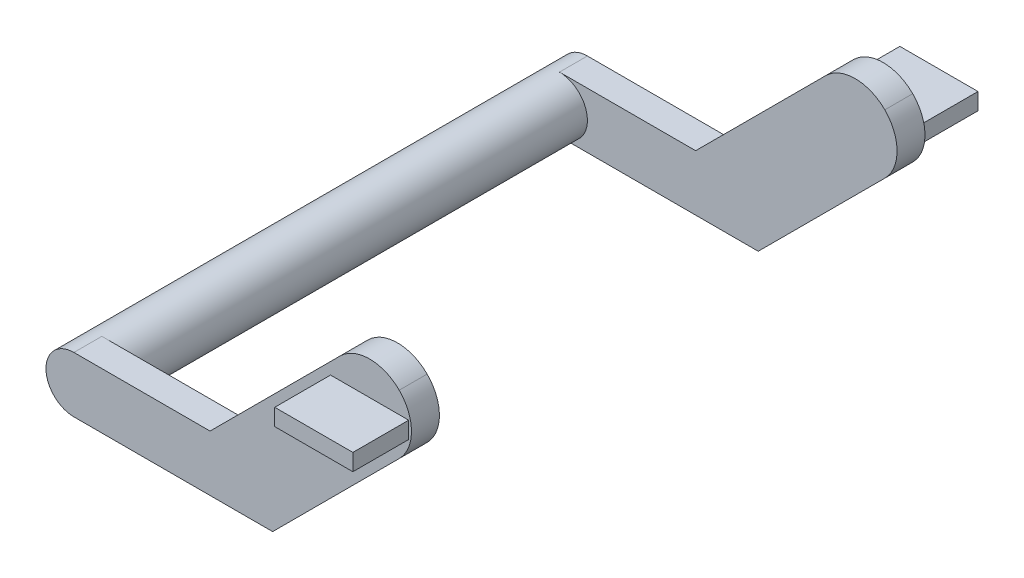
ISO-10303-21;
HEADER;
FILE_DESCRIPTION(('STEP AP214'),'2;1');
FILE_NAME('part.step','',(''),(''),'','','');
FILE_SCHEMA(('AUTOMOTIVE_DESIGN { 1 0 10303 214 1 1 1 1 }'));
ENDSEC;
DATA;
#1=APPLICATION_CONTEXT('core data for automotive mechanical design processes');
#2=APPLICATION_PROTOCOL_DEFINITION('international standard','automotive_design',2000,#1);
#3=PRODUCT_CONTEXT('',#1,'mechanical');
#4=PRODUCT('Part','Part','',(#3));
#5=PRODUCT_RELATED_PRODUCT_CATEGORY('part','',(#4));
#6=PRODUCT_DEFINITION_FORMATION('','',#4);
#7=PRODUCT_DEFINITION_CONTEXT('part definition',#1,'design');
#8=PRODUCT_DEFINITION('design','',#6,#7);
#9=PRODUCT_DEFINITION_SHAPE('','',#8);
#10=(LENGTH_UNIT() NAMED_UNIT(*) SI_UNIT(.MILLI.,.METRE.));
#11=(NAMED_UNIT(*) PLANE_ANGLE_UNIT() SI_UNIT($,.RADIAN.));
#12=(NAMED_UNIT(*) SI_UNIT($,.STERADIAN.) SOLID_ANGLE_UNIT());
#13=UNCERTAINTY_MEASURE_WITH_UNIT(LENGTH_MEASURE(1.E-05),#10,'distance_accuracy_value','');
#14=(GEOMETRIC_REPRESENTATION_CONTEXT(3) GLOBAL_UNCERTAINTY_ASSIGNED_CONTEXT((#13)) GLOBAL_UNIT_ASSIGNED_CONTEXT((#10,
#11,#12)) REPRESENTATION_CONTEXT('',''));
#15=CARTESIAN_POINT('',(0.,0.,0.));
#16=DIRECTION('',(0.,0.,1.));
#17=DIRECTION('',(1.,0.,0.));
#18=AXIS2_PLACEMENT_3D('',#15,#16,#17);
#19=CARTESIAN_POINT('',(0.,0.,-46.));
#20=DIRECTION('',(0.,0.,-1.));
#21=DIRECTION('',(1.,0.,0.));
#22=AXIS2_PLACEMENT_3D('',#19,#20,#21);
#23=PLANE('',#22);
#24=CARTESIAN_POINT('',(52.9809703885627,22.9809703885628,-46.));
#25=DIRECTION('',(0.,0.,-1.));
#26=DIRECTION('',(-1.,0.,0.));
#27=AXIS2_PLACEMENT_3D('',#24,#25,#26);
#28=CIRCLE('',#27,7.5);
#29=CARTESIAN_POINT('',(47.6776695296636,28.2842712474619,-46.));
#30=VERTEX_POINT('',#29);
#31=CARTESIAN_POINT('',(58.2842712474618,28.284271247462,-46.));
#32=VERTEX_POINT('',#31);
#33=EDGE_CURVE('E414',#30,#32,#28,.T.);
#34=ORIENTED_EDGE('',*,*,#33,.T.);
#35=CARTESIAN_POINT('',(52.9809703885627,22.9809703885628,-46.));
#36=DIRECTION('',(0.,0.,-1.));
#37=DIRECTION('',(-1.,0.,0.));
#38=AXIS2_PLACEMENT_3D('',#35,#36,#37);
#39=CIRCLE('',#38,7.5);
#40=CARTESIAN_POINT('',(58.2842712474619,17.6776695296637,-46.));
#41=VERTEX_POINT('',#40);
#42=EDGE_CURVE('E49',#32,#41,#39,.T.);
#43=ORIENTED_EDGE('',*,*,#42,.T.);
#44=DIRECTION('',(0.707106781186546,0.707106781186549,0.));
#45=VECTOR('',#44,1.);
#46=CARTESIAN_POINT('',(63.587572106361,22.9809703885629,-46.));
#47=LINE('',#46,#45);
#48=CARTESIAN_POINT('',(35.6066017177982,-5.,-46.));
#49=VERTEX_POINT('',#48);
#50=EDGE_CURVE('E291',#49,#41,#47,.T.);
#51=ORIENTED_EDGE('',*,*,#50,.F.);
#52=DIRECTION('',(1.,0.,0.));
#53=VECTOR('',#52,1.);
#54=CARTESIAN_POINT('',(35.6066017177982,-5.,-46.));
#55=LINE('',#54,#53);
#56=CARTESIAN_POINT('',(0.,-5.,-46.));
#57=VERTEX_POINT('',#56);
#58=EDGE_CURVE('E295',#57,#49,#55,.T.);
#59=ORIENTED_EDGE('',*,*,#58,.F.);
#60=CARTESIAN_POINT('',(0.,0.,-46.));
#61=DIRECTION('',(0.,0.,1.));
#62=DIRECTION('',(1.,0.,0.));
#63=AXIS2_PLACEMENT_3D('',#60,#61,#62);
#64=CIRCLE('',#63,5.);
#65=CARTESIAN_POINT('',(0.,5.,-46.));
#66=VERTEX_POINT('',#65);
#67=EDGE_CURVE('E279',#66,#57,#64,.T.);
#68=ORIENTED_EDGE('',*,*,#67,.F.);
#69=DIRECTION('',(-1.,0.,0.));
#70=VECTOR('',#69,1.);
#71=CARTESIAN_POINT('',(0.,5.,-46.));
#72=LINE('',#71,#70);
#73=CARTESIAN_POINT('',(24.3933982822018,5.,-46.));
#74=VERTEX_POINT('',#73);
#75=EDGE_CURVE('E283',#74,#66,#72,.T.);
#76=ORIENTED_EDGE('',*,*,#75,.F.);
#77=DIRECTION('',(-0.707106781186546,-0.707106781186549,0.));
#78=VECTOR('',#77,1.);
#79=CARTESIAN_POINT('',(24.3933982822018,5.,-46.));
#80=LINE('',#79,#78);
#81=EDGE_CURVE('E288',#30,#74,#80,.T.);
#82=ORIENTED_EDGE('',*,*,#81,.F.);
#83=EDGE_LOOP('',(#34,#43,#51,#59,#68,#76,#82));
#84=FACE_BOUND('',#83,.T.);
#85=DIRECTION('',(1.,0.,0.));
#86=VECTOR('',#85,1.);
#87=CARTESIAN_POINT('',(45.9809703885627,21.4809703885628,-46.));
#88=LINE('',#87,#86);
#89=CARTESIAN_POINT('',(45.9809703885627,21.4809703885628,-46.));
#90=VERTEX_POINT('',#89);
#91=CARTESIAN_POINT('',(59.9809703885627,21.4809703885628,-46.));
#92=VERTEX_POINT('',#91);
#93=EDGE_CURVE('E224',#90,#92,#88,.T.);
#94=ORIENTED_EDGE('',*,*,#93,.T.);
#95=DIRECTION('',(0.,1.,0.));
#96=VECTOR('',#95,1.);
#97=CARTESIAN_POINT('',(59.9809703885627,21.4809703885628,-46.));
#98=LINE('',#97,#96);
#99=CARTESIAN_POINT('',(59.9809703885627,24.4809703885628,-46.));
#100=VERTEX_POINT('',#99);
#101=EDGE_CURVE('E56',#92,#100,#98,.T.);
#102=ORIENTED_EDGE('',*,*,#101,.T.);
#103=DIRECTION('',(-1.,0.,0.));
#104=VECTOR('',#103,1.);
#105=CARTESIAN_POINT('',(45.9809703885627,24.4809703885628,-46.));
#106=LINE('',#105,#104);
#107=CARTESIAN_POINT('',(45.9809703885627,24.4809703885628,-46.));
#108=VERTEX_POINT('',#107);
#109=EDGE_CURVE('E210',#100,#108,#106,.T.);
#110=ORIENTED_EDGE('',*,*,#109,.T.);
#111=DIRECTION('',(0.,-1.,0.));
#112=VECTOR('',#111,1.);
#113=CARTESIAN_POINT('',(45.9809703885627,21.4809703885628,-46.));
#114=LINE('',#113,#112);
#115=EDGE_CURVE('E227',#108,#90,#114,.T.);
#116=ORIENTED_EDGE('',*,*,#115,.T.);
#117=EDGE_LOOP('',(#94,#102,#110,#116));
#118=FACE_BOUND('',#117,.T.);
#119=ADVANCED_FACE('F39',(#84,#118),#23,.T.);
#120=CARTESIAN_POINT('',(0.,0.,46.));
#121=DIRECTION('',(0.,0.,1.));
#122=DIRECTION('',(1.,0.,0.));
#123=AXIS2_PLACEMENT_3D('',#120,#121,#122);
#124=PLANE('',#123);
#125=DIRECTION('',(0.707106781186546,0.707106781186549,0.));
#126=VECTOR('',#125,1.);
#127=CARTESIAN_POINT('',(63.587572106361,22.9809703885629,46.));
#128=LINE('',#127,#126);
#129=CARTESIAN_POINT('',(35.6066017177982,-5.,46.));
#130=VERTEX_POINT('',#129);
#131=CARTESIAN_POINT('',(58.2842712474619,17.6776695296637,46.));
#132=VERTEX_POINT('',#131);
#133=EDGE_CURVE('E336',#130,#132,#128,.T.);
#134=ORIENTED_EDGE('',*,*,#133,.T.);
#135=CARTESIAN_POINT('',(52.9809703885627,22.9809703885628,46.));
#136=DIRECTION('',(0.,0.,1.));
#137=DIRECTION('',(1.,0.,0.));
#138=AXIS2_PLACEMENT_3D('',#135,#136,#137);
#139=CIRCLE('',#138,7.5);
#140=CARTESIAN_POINT('',(58.2842712474618,28.284271247462,46.));
#141=VERTEX_POINT('',#140);
#142=EDGE_CURVE('E395',#132,#141,#139,.T.);
#143=ORIENTED_EDGE('',*,*,#142,.T.);
#144=CARTESIAN_POINT('',(52.9809703885627,22.9809703885628,46.));
#145=DIRECTION('',(0.,0.,1.));
#146=DIRECTION('',(1.,0.,0.));
#147=AXIS2_PLACEMENT_3D('',#144,#145,#146);
#148=CIRCLE('',#147,7.5);
#149=CARTESIAN_POINT('',(47.6776695296636,28.2842712474619,46.));
#150=VERTEX_POINT('',#149);
#151=EDGE_CURVE('E392',#141,#150,#148,.T.);
#152=ORIENTED_EDGE('',*,*,#151,.T.);
#153=DIRECTION('',(-0.707106781186546,-0.707106781186549,0.));
#154=VECTOR('',#153,1.);
#155=CARTESIAN_POINT('',(24.3933982822018,5.,46.));
#156=LINE('',#155,#154);
#157=CARTESIAN_POINT('',(24.3933982822018,5.,46.));
#158=VERTEX_POINT('',#157);
#159=EDGE_CURVE('E340',#150,#158,#156,.T.);
#160=ORIENTED_EDGE('',*,*,#159,.T.);
#161=DIRECTION('',(-1.,0.,0.));
#162=VECTOR('',#161,1.);
#163=CARTESIAN_POINT('',(0.,5.,46.));
#164=LINE('',#163,#162);
#165=CARTESIAN_POINT('',(0.,5.,46.));
#166=VERTEX_POINT('',#165);
#167=EDGE_CURVE('E343',#158,#166,#164,.T.);
#168=ORIENTED_EDGE('',*,*,#167,.T.);
#169=CARTESIAN_POINT('',(0.,0.,46.));
#170=DIRECTION('',(0.,0.,1.));
#171=DIRECTION('',(1.,0.,0.));
#172=AXIS2_PLACEMENT_3D('',#169,#170,#171);
#173=CIRCLE('',#172,5.);
#174=CARTESIAN_POINT('',(0.,-5.,46.));
#175=VERTEX_POINT('',#174);
#176=EDGE_CURVE('E328',#166,#175,#173,.T.);
#177=ORIENTED_EDGE('',*,*,#176,.T.);
#178=DIRECTION('',(1.,0.,0.));
#179=VECTOR('',#178,1.);
#180=CARTESIAN_POINT('',(35.6066017177982,-5.,46.));
#181=LINE('',#180,#179);
#182=EDGE_CURVE('E332',#175,#130,#181,.T.);
#183=ORIENTED_EDGE('',*,*,#182,.T.);
#184=EDGE_LOOP('',(#134,#143,#152,#160,#168,#177,#183));
#185=FACE_BOUND('',#184,.T.);
#186=DIRECTION('',(-1.,0.,0.));
#187=VECTOR('',#186,1.);
#188=CARTESIAN_POINT('',(45.9809703885627,24.4809703885628,46.));
#189=LINE('',#188,#187);
#190=CARTESIAN_POINT('',(59.9809703885627,24.4809703885628,46.));
#191=VERTEX_POINT('',#190);
#192=CARTESIAN_POINT('',(45.9809703885627,24.4809703885628,46.));
#193=VERTEX_POINT('',#192);
#194=EDGE_CURVE('E259',#191,#193,#189,.T.);
#195=ORIENTED_EDGE('',*,*,#194,.F.);
#196=DIRECTION('',(0.,1.,0.));
#197=VECTOR('',#196,1.);
#198=CARTESIAN_POINT('',(59.9809703885627,21.4809703885628,46.));
#199=LINE('',#198,#197);
#200=CARTESIAN_POINT('',(59.9809703885627,21.4809703885628,46.));
#201=VERTEX_POINT('',#200);
#202=EDGE_CURVE('E198',#201,#191,#199,.T.);
#203=ORIENTED_EDGE('',*,*,#202,.F.);
#204=DIRECTION('',(1.,0.,0.));
#205=VECTOR('',#204,1.);
#206=CARTESIAN_POINT('',(45.9809703885627,21.4809703885628,46.));
#207=LINE('',#206,#205);
#208=CARTESIAN_POINT('',(45.9809703885627,21.4809703885628,46.));
#209=VERTEX_POINT('',#208);
#210=EDGE_CURVE('E246',#209,#201,#207,.T.);
#211=ORIENTED_EDGE('',*,*,#210,.F.);
#212=DIRECTION('',(0.,-1.,0.));
#213=VECTOR('',#212,1.);
#214=CARTESIAN_POINT('',(45.9809703885627,21.4809703885628,46.));
#215=LINE('',#214,#213);
#216=EDGE_CURVE('E262',#193,#209,#215,.T.);
#217=ORIENTED_EDGE('',*,*,#216,.F.);
#218=EDGE_LOOP('',(#195,#203,#211,#217));
#219=FACE_BOUND('',#218,.T.);
#220=ADVANCED_FACE('F462',(#185,#219),#124,.T.);
#221=CARTESIAN_POINT('',(0.,0.,-41.));
#222=DIRECTION('',(0.,0.,1.));
#223=DIRECTION('',(1.,0.,0.));
#224=AXIS2_PLACEMENT_3D('',#221,#222,#223);
#225=CYLINDRICAL_SURFACE('',#224,5.);
#226=CARTESIAN_POINT('',(0.,0.,-41.));
#227=DIRECTION('',(0.,0.,1.));
#228=DIRECTION('',(1.,0.,0.));
#229=AXIS2_PLACEMENT_3D('',#226,#227,#228);
#230=CIRCLE('',#229,5.);
#231=CARTESIAN_POINT('',(0.,-5.,-41.));
#232=VERTEX_POINT('',#231);
#233=CARTESIAN_POINT('',(0.,5.,-41.));
#234=VERTEX_POINT('',#233);
#235=EDGE_CURVE('E378',#232,#234,#230,.T.);
#236=ORIENTED_EDGE('',*,*,#235,.T.);
#237=DIRECTION('',(0.,0.,1.));
#238=VECTOR('',#237,1.);
#239=CARTESIAN_POINT('',(0.,5.,-46.));
#240=LINE('',#239,#238);
#241=EDGE_CURVE('E323',#66,#234,#240,.T.);
#242=ORIENTED_EDGE('',*,*,#241,.F.);
#243=ORIENTED_EDGE('',*,*,#67,.T.);
#244=DIRECTION('',(0.,0.,1.));
#245=VECTOR('',#244,1.);
#246=CARTESIAN_POINT('',(0.,-5.,-46.));
#247=LINE('',#246,#245);
#248=EDGE_CURVE('E299',#57,#232,#247,.T.);
#249=ORIENTED_EDGE('',*,*,#248,.T.);
#250=EDGE_LOOP('',(#236,#242,#243,#249));
#251=FACE_BOUND('',#250,.T.);
#252=CARTESIAN_POINT('',(0.,0.,41.));
#253=DIRECTION('',(0.,0.,1.));
#254=DIRECTION('',(1.,0.,0.));
#255=AXIS2_PLACEMENT_3D('',#252,#253,#254);
#256=CIRCLE('',#255,5.);
#257=CARTESIAN_POINT('',(0.,-5.,41.));
#258=VERTEX_POINT('',#257);
#259=CARTESIAN_POINT('',(0.,5.,41.));
#260=VERTEX_POINT('',#259);
#261=EDGE_CURVE('E375',#258,#260,#256,.T.);
#262=ORIENTED_EDGE('',*,*,#261,.F.);
#263=DIRECTION('',(0.,0.,-1.));
#264=VECTOR('',#263,1.);
#265=CARTESIAN_POINT('',(0.,-5.,46.));
#266=LINE('',#265,#264);
#267=EDGE_CURVE('E371',#175,#258,#266,.T.);
#268=ORIENTED_EDGE('',*,*,#267,.F.);
#269=ORIENTED_EDGE('',*,*,#176,.F.);
#270=DIRECTION('',(0.,0.,-1.));
#271=VECTOR('',#270,1.);
#272=CARTESIAN_POINT('',(0.,5.,46.));
#273=LINE('',#272,#271);
#274=EDGE_CURVE('E346',#166,#260,#273,.T.);
#275=ORIENTED_EDGE('',*,*,#274,.T.);
#276=EDGE_LOOP('',(#262,#268,#269,#275));
#277=FACE_BOUND('',#276,.T.);
#278=ADVANCED_FACE('F449',(#251,#277),#225,.T.);
#279=CARTESIAN_POINT('',(0.,0.,41.));
#280=DIRECTION('',(0.,0.,1.));
#281=DIRECTION('',(1.,0.,0.));
#282=AXIS2_PLACEMENT_3D('',#279,#280,#281);
#283=PLANE('',#282);
#284=CARTESIAN_POINT('',(52.9809703885627,22.9809703885628,41.));
#285=DIRECTION('',(0.,0.,1.));
#286=DIRECTION('',(1.,0.,0.));
#287=AXIS2_PLACEMENT_3D('',#284,#285,#286);
#288=CIRCLE('',#287,7.5);
#289=CARTESIAN_POINT('',(47.6776695296636,28.2842712474619,41.));
#290=VERTEX_POINT('',#289);
#291=CARTESIAN_POINT('',(58.2842712474618,28.284271247462,41.));
#292=VERTEX_POINT('',#291);
#293=EDGE_CURVE('E382',#290,#292,#288,.F.);
#294=ORIENTED_EDGE('',*,*,#293,.T.);
#295=CARTESIAN_POINT('',(52.9809703885627,22.9809703885628,41.));
#296=DIRECTION('',(0.,0.,1.));
#297=DIRECTION('',(1.,0.,0.));
#298=AXIS2_PLACEMENT_3D('',#295,#296,#297);
#299=CIRCLE('',#298,7.5);
#300=CARTESIAN_POINT('',(58.2842712474619,17.6776695296637,41.));
#301=VERTEX_POINT('',#300);
#302=EDGE_CURVE('E385',#292,#301,#299,.F.);
#303=ORIENTED_EDGE('',*,*,#302,.T.);
#304=DIRECTION('',(0.707106781186546,0.707106781186549,0.));
#305=VECTOR('',#304,1.);
#306=CARTESIAN_POINT('',(63.587572106361,22.9809703885629,41.));
#307=LINE('',#306,#305);
#308=CARTESIAN_POINT('',(35.6066017177982,-5.,41.));
#309=VERTEX_POINT('',#308);
#310=EDGE_CURVE('E350',#309,#301,#307,.T.);
#311=ORIENTED_EDGE('',*,*,#310,.F.);
#312=DIRECTION('',(1.,0.,0.));
#313=VECTOR('',#312,1.);
#314=CARTESIAN_POINT('',(35.6066017177982,-5.,41.));
#315=LINE('',#314,#313);
#316=EDGE_CURVE('E347',#258,#309,#315,.T.);
#317=ORIENTED_EDGE('',*,*,#316,.F.);
#318=ORIENTED_EDGE('',*,*,#261,.T.);
#319=DIRECTION('',(-1.,0.,0.));
#320=VECTOR('',#319,1.);
#321=CARTESIAN_POINT('',(0.,5.,41.));
#322=LINE('',#321,#320);
#323=CARTESIAN_POINT('',(24.3933982822018,5.,41.));
#324=VERTEX_POINT('',#323);
#325=EDGE_CURVE('E333',#324,#260,#322,.T.);
#326=ORIENTED_EDGE('',*,*,#325,.F.);
#327=DIRECTION('',(-0.707106781186546,-0.707106781186549,0.));
#328=VECTOR('',#327,1.);
#329=CARTESIAN_POINT('',(24.3933982822018,5.,41.));
#330=LINE('',#329,#328);
#331=EDGE_CURVE('E354',#290,#324,#330,.T.);
#332=ORIENTED_EDGE('',*,*,#331,.F.);
#333=EDGE_LOOP('',(#294,#303,#311,#317,#318,#326,#332));
#334=FACE_BOUND('',#333,.T.);
#335=ADVANCED_FACE('F592',(#334),#283,.F.);
#336=CARTESIAN_POINT('',(35.6066017177982,-5.,46.));
#337=DIRECTION('',(0.,1.,0.));
#338=DIRECTION('',(0.,0.,1.));
#339=AXIS2_PLACEMENT_3D('',#336,#337,#338);
#340=PLANE('',#339);
#341=ORIENTED_EDGE('',*,*,#316,.T.);
#342=DIRECTION('',(0.,0.,-1.));
#343=VECTOR('',#342,1.);
#344=CARTESIAN_POINT('',(35.6066017177982,-5.,46.));
#345=LINE('',#344,#343);
#346=EDGE_CURVE('E367',#130,#309,#345,.T.);
#347=ORIENTED_EDGE('',*,*,#346,.F.);
#348=ORIENTED_EDGE('',*,*,#182,.F.);
#349=ORIENTED_EDGE('',*,*,#267,.T.);
#350=EDGE_LOOP('',(#341,#347,#348,#349));
#351=FACE_BOUND('',#350,.T.);
#352=ADVANCED_FACE('F635',(#351),#340,.F.);
#353=CARTESIAN_POINT('',(63.587572106361,22.9809703885629,46.));
#354=DIRECTION('',(-0.707106781186549,0.707106781186546,0.));
#355=DIRECTION('',(-0.707106781186546,-0.707106781186549,0.));
#356=AXIS2_PLACEMENT_3D('',#353,#354,#355);
#357=PLANE('',#356);
#358=ORIENTED_EDGE('',*,*,#310,.T.);
#359=DIRECTION('',(0.,0.,-1.));
#360=VECTOR('',#359,1.);
#361=CARTESIAN_POINT('',(58.2842712474619,17.6776695296637,46.));
#362=LINE('',#361,#360);
#363=EDGE_CURVE('E388',#301,#132,#362,.F.);
#364=ORIENTED_EDGE('',*,*,#363,.T.);
#365=ORIENTED_EDGE('',*,*,#133,.F.);
#366=ORIENTED_EDGE('',*,*,#346,.T.);
#367=EDGE_LOOP('',(#358,#364,#365,#366));
#368=FACE_BOUND('',#367,.T.);
#369=ADVANCED_FACE('F625',(#368),#357,.F.);
#370=CARTESIAN_POINT('',(24.3933982822018,5.,46.));
#371=DIRECTION('',(0.707106781186549,-0.707106781186546,0.));
#372=DIRECTION('',(0.707106781186546,0.707106781186549,0.));
#373=AXIS2_PLACEMENT_3D('',#370,#371,#372);
#374=PLANE('',#373);
#375=ORIENTED_EDGE('',*,*,#159,.F.);
#376=DIRECTION('',(0.,0.,-1.));
#377=VECTOR('',#376,1.);
#378=CARTESIAN_POINT('',(47.6776695296636,28.2842712474619,46.));
#379=LINE('',#378,#377);
#380=EDGE_CURVE('E398',#150,#290,#379,.T.);
#381=ORIENTED_EDGE('',*,*,#380,.T.);
#382=ORIENTED_EDGE('',*,*,#331,.T.);
#383=DIRECTION('',(0.,0.,-1.));
#384=VECTOR('',#383,1.);
#385=CARTESIAN_POINT('',(24.3933982822018,5.,46.));
#386=LINE('',#385,#384);
#387=EDGE_CURVE('E363',#158,#324,#386,.T.);
#388=ORIENTED_EDGE('',*,*,#387,.F.);
#389=EDGE_LOOP('',(#375,#381,#382,#388));
#390=FACE_BOUND('',#389,.T.);
#391=ADVANCED_FACE('F620',(#390),#374,.F.);
#392=CARTESIAN_POINT('',(0.,5.,46.));
#393=DIRECTION('',(0.,-1.,0.));
#394=DIRECTION('',(0.,0.,-1.));
#395=AXIS2_PLACEMENT_3D('',#392,#393,#394);
#396=PLANE('',#395);
#397=ORIENTED_EDGE('',*,*,#325,.T.);
#398=ORIENTED_EDGE('',*,*,#274,.F.);
#399=ORIENTED_EDGE('',*,*,#167,.F.);
#400=ORIENTED_EDGE('',*,*,#387,.T.);
#401=EDGE_LOOP('',(#397,#398,#399,#400));
#402=FACE_BOUND('',#401,.T.);
#403=ADVANCED_FACE('F612',(#402),#396,.F.);
#404=CARTESIAN_POINT('',(52.9809703885627,22.9809703885628,46.));
#405=DIRECTION('',(0.,0.,-1.));
#406=DIRECTION('',(-1.,0.,0.));
#407=AXIS2_PLACEMENT_3D('',#404,#405,#406);
#408=CYLINDRICAL_SURFACE('',#407,7.5);
#409=ORIENTED_EDGE('',*,*,#380,.F.);
#410=ORIENTED_EDGE('',*,*,#151,.F.);
#411=DIRECTION('',(0.,0.,-1.));
#412=VECTOR('',#411,1.);
#413=CARTESIAN_POINT('',(58.2842712474618,28.284271247462,46.));
#414=LINE('',#413,#412);
#415=EDGE_CURVE('E327',#292,#141,#414,.F.);
#416=ORIENTED_EDGE('',*,*,#415,.F.);
#417=ORIENTED_EDGE('',*,*,#293,.F.);
#418=EDGE_LOOP('',(#409,#410,#416,#417));
#419=FACE_BOUND('',#418,.T.);
#420=ADVANCED_FACE('F602',(#419),#408,.T.);
#421=CARTESIAN_POINT('',(52.9809703885627,22.9809703885628,46.));
#422=DIRECTION('',(0.,0.,-1.));
#423=DIRECTION('',(-1.,0.,0.));
#424=AXIS2_PLACEMENT_3D('',#421,#422,#423);
#425=CYLINDRICAL_SURFACE('',#424,7.5);
#426=ORIENTED_EDGE('',*,*,#142,.F.);
#427=ORIENTED_EDGE('',*,*,#363,.F.);
#428=ORIENTED_EDGE('',*,*,#302,.F.);
#429=ORIENTED_EDGE('',*,*,#415,.T.);
#430=EDGE_LOOP('',(#426,#427,#428,#429));
#431=FACE_BOUND('',#430,.T.);
#432=ADVANCED_FACE('F582',(#431),#425,.T.);
#433=CARTESIAN_POINT('',(0.,5.,-46.));
#434=DIRECTION('',(0.,1.,0.));
#435=DIRECTION('',(0.,0.,1.));
#436=AXIS2_PLACEMENT_3D('',#433,#434,#435);
#437=PLANE('',#436);
#438=DIRECTION('',(-1.,0.,0.));
#439=VECTOR('',#438,1.);
#440=CARTESIAN_POINT('',(0.,5.,-41.));
#441=LINE('',#440,#439);
#442=CARTESIAN_POINT('',(24.3933982822018,5.,-41.));
#443=VERTEX_POINT('',#442);
#444=EDGE_CURVE('E300',#443,#234,#441,.T.);
#445=ORIENTED_EDGE('',*,*,#444,.F.);
#446=DIRECTION('',(0.,0.,1.));
#447=VECTOR('',#446,1.);
#448=CARTESIAN_POINT('',(24.3933982822018,5.,-46.));
#449=LINE('',#448,#447);
#450=EDGE_CURVE('E319',#74,#443,#449,.T.);
#451=ORIENTED_EDGE('',*,*,#450,.F.);
#452=ORIENTED_EDGE('',*,*,#75,.T.);
#453=ORIENTED_EDGE('',*,*,#241,.T.);
#454=EDGE_LOOP('',(#445,#451,#452,#453));
#455=FACE_BOUND('',#454,.T.);
#456=ADVANCED_FACE('F446',(#455),#437,.T.);
#457=CARTESIAN_POINT('',(24.3933982822018,5.,-46.));
#458=DIRECTION('',(-0.707106781186549,0.707106781186546,0.));
#459=DIRECTION('',(-0.707106781186546,-0.707106781186549,0.));
#460=AXIS2_PLACEMENT_3D('',#457,#458,#459);
#461=PLANE('',#460);
#462=DIRECTION('',(-0.707106781186546,-0.707106781186549,0.));
#463=VECTOR('',#462,1.);
#464=CARTESIAN_POINT('',(24.3933982822018,5.,-41.));
#465=LINE('',#464,#463);
#466=CARTESIAN_POINT('',(47.6776695296636,28.2842712474619,-41.));
#467=VERTEX_POINT('',#466);
#468=EDGE_CURVE('E303',#467,#443,#465,.T.);
#469=ORIENTED_EDGE('',*,*,#468,.F.);
#470=DIRECTION('',(0.,0.,1.));
#471=VECTOR('',#470,1.);
#472=CARTESIAN_POINT('',(47.6776695296636,28.2842712474619,-46.));
#473=LINE('',#472,#471);
#474=EDGE_CURVE('E11',#467,#30,#473,.F.);
#475=ORIENTED_EDGE('',*,*,#474,.T.);
#476=ORIENTED_EDGE('',*,*,#81,.T.);
#477=ORIENTED_EDGE('',*,*,#450,.T.);
#478=EDGE_LOOP('',(#469,#475,#476,#477));
#479=FACE_BOUND('',#478,.T.);
#480=ADVANCED_FACE('F440',(#479),#461,.T.);
#481=CARTESIAN_POINT('',(63.587572106361,22.9809703885629,-46.));
#482=DIRECTION('',(0.707106781186549,-0.707106781186546,0.));
#483=DIRECTION('',(0.707106781186546,0.707106781186549,0.));
#484=AXIS2_PLACEMENT_3D('',#481,#482,#483);
#485=PLANE('',#484);
#486=ORIENTED_EDGE('',*,*,#50,.T.);
#487=DIRECTION('',(0.,0.,1.));
#488=VECTOR('',#487,1.);
#489=CARTESIAN_POINT('',(58.2842712474619,17.6776695296637,-46.));
#490=LINE('',#489,#488);
#491=CARTESIAN_POINT('',(58.2842712474619,17.6776695296637,-41.));
#492=VERTEX_POINT('',#491);
#493=EDGE_CURVE('E401',#41,#492,#490,.T.);
#494=ORIENTED_EDGE('',*,*,#493,.T.);
#495=DIRECTION('',(0.707106781186546,0.707106781186549,0.));
#496=VECTOR('',#495,1.);
#497=CARTESIAN_POINT('',(63.587572106361,22.9809703885629,-41.));
#498=LINE('',#497,#496);
#499=CARTESIAN_POINT('',(35.6066017177982,-5.,-41.));
#500=VERTEX_POINT('',#499);
#501=EDGE_CURVE('E306',#500,#492,#498,.T.);
#502=ORIENTED_EDGE('',*,*,#501,.F.);
#503=DIRECTION('',(0.,0.,1.));
#504=VECTOR('',#503,1.);
#505=CARTESIAN_POINT('',(35.6066017177982,-5.,-46.));
#506=LINE('',#505,#504);
#507=EDGE_CURVE('E316',#49,#500,#506,.T.);
#508=ORIENTED_EDGE('',*,*,#507,.F.);
#509=EDGE_LOOP('',(#486,#494,#502,#508));
#510=FACE_BOUND('',#509,.T.);
#511=ADVANCED_FACE('F430',(#510),#485,.T.);
#512=CARTESIAN_POINT('',(35.6066017177982,-5.,-46.));
#513=DIRECTION('',(0.,-1.,0.));
#514=DIRECTION('',(0.,0.,-1.));
#515=AXIS2_PLACEMENT_3D('',#512,#513,#514);
#516=PLANE('',#515);
#517=DIRECTION('',(1.,0.,0.));
#518=VECTOR('',#517,1.);
#519=CARTESIAN_POINT('',(35.6066017177982,-5.,-41.));
#520=LINE('',#519,#518);
#521=EDGE_CURVE('E284',#232,#500,#520,.T.);
#522=ORIENTED_EDGE('',*,*,#521,.F.);
#523=ORIENTED_EDGE('',*,*,#248,.F.);
#524=ORIENTED_EDGE('',*,*,#58,.T.);
#525=ORIENTED_EDGE('',*,*,#507,.T.);
#526=EDGE_LOOP('',(#522,#523,#524,#525));
#527=FACE_BOUND('',#526,.T.);
#528=ADVANCED_FACE('F452',(#527),#516,.T.);
#529=CARTESIAN_POINT('',(0.,0.,-41.));
#530=DIRECTION('',(0.,0.,-1.));
#531=DIRECTION('',(1.,0.,0.));
#532=AXIS2_PLACEMENT_3D('',#529,#530,#531);
#533=PLANE('',#532);
#534=ORIENTED_EDGE('',*,*,#501,.T.);
#535=CARTESIAN_POINT('',(52.9809703885627,22.9809703885628,-41.));
#536=DIRECTION('',(0.,0.,-1.));
#537=DIRECTION('',(-1.,0.,0.));
#538=AXIS2_PLACEMENT_3D('',#535,#536,#537);
#539=CIRCLE('',#538,7.5);
#540=CARTESIAN_POINT('',(58.2842712474618,28.284271247462,-41.));
#541=VERTEX_POINT('',#540);
#542=EDGE_CURVE('E411',#492,#541,#539,.F.);
#543=ORIENTED_EDGE('',*,*,#542,.T.);
#544=CARTESIAN_POINT('',(52.9809703885627,22.9809703885628,-41.));
#545=DIRECTION('',(0.,0.,-1.));
#546=DIRECTION('',(-1.,0.,0.));
#547=AXIS2_PLACEMENT_3D('',#544,#545,#546);
#548=CIRCLE('',#547,7.5);
#549=EDGE_CURVE('E408',#541,#467,#548,.F.);
#550=ORIENTED_EDGE('',*,*,#549,.T.);
#551=ORIENTED_EDGE('',*,*,#468,.T.);
#552=ORIENTED_EDGE('',*,*,#444,.T.);
#553=ORIENTED_EDGE('',*,*,#235,.F.);
#554=ORIENTED_EDGE('',*,*,#521,.T.);
#555=EDGE_LOOP('',(#534,#543,#550,#551,#552,#553,#554));
#556=FACE_BOUND('',#555,.T.);
#557=ADVANCED_FACE('F435',(#556),#533,.F.);
#558=CARTESIAN_POINT('',(52.9809703885627,22.9809703885628,-46.));
#559=DIRECTION('',(0.,0.,1.));
#560=DIRECTION('',(1.,0.,0.));
#561=AXIS2_PLACEMENT_3D('',#558,#559,#560);
#562=CYLINDRICAL_SURFACE('',#561,7.5);
#563=DIRECTION('',(0.,0.,1.));
#564=VECTOR('',#563,1.);
#565=CARTESIAN_POINT('',(58.2842712474618,28.284271247462,-46.));
#566=LINE('',#565,#564);
#567=EDGE_CURVE('E43',#32,#541,#566,.T.);
#568=ORIENTED_EDGE('',*,*,#567,.F.);
#569=ORIENTED_EDGE('',*,*,#33,.F.);
#570=ORIENTED_EDGE('',*,*,#474,.F.);
#571=ORIENTED_EDGE('',*,*,#549,.F.);
#572=EDGE_LOOP('',(#568,#569,#570,#571));
#573=FACE_BOUND('',#572,.T.);
#574=ADVANCED_FACE('F41',(#573),#562,.T.);
#575=CARTESIAN_POINT('',(52.9809703885627,22.9809703885628,-46.));
#576=DIRECTION('',(0.,0.,1.));
#577=DIRECTION('',(1.,0.,0.));
#578=AXIS2_PLACEMENT_3D('',#575,#576,#577);
#579=CYLINDRICAL_SURFACE('',#578,7.5);
#580=ORIENTED_EDGE('',*,*,#42,.F.);
#581=ORIENTED_EDGE('',*,*,#567,.T.);
#582=ORIENTED_EDGE('',*,*,#542,.F.);
#583=ORIENTED_EDGE('',*,*,#493,.F.);
#584=EDGE_LOOP('',(#580,#581,#582,#583));
#585=FACE_BOUND('',#584,.T.);
#586=ADVANCED_FACE('F432',(#585),#579,.T.);
#587=CARTESIAN_POINT('',(59.9809703885627,21.4809703885628,56.));
#588=DIRECTION('',(-1.,0.,0.));
#589=DIRECTION('',(0.,0.,1.));
#590=AXIS2_PLACEMENT_3D('',#587,#588,#589);
#591=PLANE('',#590);
#592=ORIENTED_EDGE('',*,*,#202,.T.);
#593=DIRECTION('',(0.,0.,-1.));
#594=VECTOR('',#593,1.);
#595=CARTESIAN_POINT('',(59.9809703885627,24.4809703885628,56.));
#596=LINE('',#595,#594);
#597=CARTESIAN_POINT('',(59.9809703885627,24.4809703885628,56.));
#598=VERTEX_POINT('',#597);
#599=EDGE_CURVE('E276',#598,#191,#596,.T.);
#600=ORIENTED_EDGE('',*,*,#599,.F.);
#601=DIRECTION('',(0.,1.,0.));
#602=VECTOR('',#601,1.);
#603=CARTESIAN_POINT('',(59.9809703885627,21.4809703885628,56.));
#604=LINE('',#603,#602);
#605=CARTESIAN_POINT('',(59.9809703885627,21.4809703885628,56.));
#606=VERTEX_POINT('',#605);
#607=EDGE_CURVE('E241',#606,#598,#604,.T.);
#608=ORIENTED_EDGE('',*,*,#607,.F.);
#609=DIRECTION('',(0.,0.,-1.));
#610=VECTOR('',#609,1.);
#611=CARTESIAN_POINT('',(59.9809703885627,21.4809703885628,56.));
#612=LINE('',#611,#610);
#613=EDGE_CURVE('E255',#606,#201,#612,.T.);
#614=ORIENTED_EDGE('',*,*,#613,.T.);
#615=EDGE_LOOP('',(#592,#600,#608,#614));
#616=FACE_BOUND('',#615,.T.);
#617=ADVANCED_FACE('F470',(#616),#591,.F.);
#618=CARTESIAN_POINT('',(45.9809703885627,24.4809703885628,56.));
#619=DIRECTION('',(0.,-1.,0.));
#620=DIRECTION('',(0.,0.,-1.));
#621=AXIS2_PLACEMENT_3D('',#618,#619,#620);
#622=PLANE('',#621);
#623=ORIENTED_EDGE('',*,*,#194,.T.);
#624=DIRECTION('',(0.,0.,-1.));
#625=VECTOR('',#624,1.);
#626=CARTESIAN_POINT('',(45.9809703885627,24.4809703885628,56.));
#627=LINE('',#626,#625);
#628=CARTESIAN_POINT('',(45.9809703885627,24.4809703885628,56.));
#629=VERTEX_POINT('',#628);
#630=EDGE_CURVE('E272',#629,#193,#627,.T.);
#631=ORIENTED_EDGE('',*,*,#630,.F.);
#632=DIRECTION('',(-1.,0.,0.));
#633=VECTOR('',#632,1.);
#634=CARTESIAN_POINT('',(45.9809703885627,24.4809703885628,56.));
#635=LINE('',#634,#633);
#636=EDGE_CURVE('E245',#598,#629,#635,.T.);
#637=ORIENTED_EDGE('',*,*,#636,.F.);
#638=ORIENTED_EDGE('',*,*,#599,.T.);
#639=EDGE_LOOP('',(#623,#631,#637,#638));
#640=FACE_BOUND('',#639,.T.);
#641=ADVANCED_FACE('F473',(#640),#622,.F.);
#642=CARTESIAN_POINT('',(45.9809703885627,21.4809703885628,56.));
#643=DIRECTION('',(1.,0.,0.));
#644=DIRECTION('',(0.,0.,-1.));
#645=AXIS2_PLACEMENT_3D('',#642,#643,#644);
#646=PLANE('',#645);
#647=ORIENTED_EDGE('',*,*,#216,.T.);
#648=DIRECTION('',(0.,0.,-1.));
#649=VECTOR('',#648,1.);
#650=CARTESIAN_POINT('',(45.9809703885627,21.4809703885628,56.));
#651=LINE('',#650,#649);
#652=CARTESIAN_POINT('',(45.9809703885627,21.4809703885628,56.));
#653=VERTEX_POINT('',#652);
#654=EDGE_CURVE('E64',#653,#209,#651,.T.);
#655=ORIENTED_EDGE('',*,*,#654,.F.);
#656=DIRECTION('',(0.,-1.,0.));
#657=VECTOR('',#656,1.);
#658=CARTESIAN_POINT('',(45.9809703885627,21.4809703885628,56.));
#659=LINE('',#658,#657);
#660=EDGE_CURVE('E249',#629,#653,#659,.T.);
#661=ORIENTED_EDGE('',*,*,#660,.F.);
#662=ORIENTED_EDGE('',*,*,#630,.T.);
#663=EDGE_LOOP('',(#647,#655,#661,#662));
#664=FACE_BOUND('',#663,.T.);
#665=ADVANCED_FACE('F477',(#664),#646,.F.);
#666=CARTESIAN_POINT('',(45.9809703885627,21.4809703885628,56.));
#667=DIRECTION('',(0.,1.,0.));
#668=DIRECTION('',(0.,0.,1.));
#669=AXIS2_PLACEMENT_3D('',#666,#667,#668);
#670=PLANE('',#669);
#671=ORIENTED_EDGE('',*,*,#210,.T.);
#672=ORIENTED_EDGE('',*,*,#613,.F.);
#673=DIRECTION('',(1.,0.,0.));
#674=VECTOR('',#673,1.);
#675=CARTESIAN_POINT('',(45.9809703885627,21.4809703885628,56.));
#676=LINE('',#675,#674);
#677=EDGE_CURVE('E252',#653,#606,#676,.T.);
#678=ORIENTED_EDGE('',*,*,#677,.F.);
#679=ORIENTED_EDGE('',*,*,#654,.T.);
#680=EDGE_LOOP('',(#671,#672,#678,#679));
#681=FACE_BOUND('',#680,.T.);
#682=ADVANCED_FACE('F481',(#681),#670,.F.);
#683=CARTESIAN_POINT('',(0.,0.,56.));
#684=DIRECTION('',(0.,0.,-1.));
#685=DIRECTION('',(-1.,0.,0.));
#686=AXIS2_PLACEMENT_3D('',#683,#684,#685);
#687=PLANE('',#686);
#688=ORIENTED_EDGE('',*,*,#607,.T.);
#689=ORIENTED_EDGE('',*,*,#636,.T.);
#690=ORIENTED_EDGE('',*,*,#660,.T.);
#691=ORIENTED_EDGE('',*,*,#677,.T.);
#692=EDGE_LOOP('',(#688,#689,#690,#691));
#693=FACE_BOUND('',#692,.T.);
#694=ADVANCED_FACE('F485',(#693),#687,.F.);
#695=CARTESIAN_POINT('',(59.9809703885627,21.4809703885628,-56.));
#696=DIRECTION('',(1.,0.,0.));
#697=DIRECTION('',(0.,0.,-1.));
#698=AXIS2_PLACEMENT_3D('',#695,#696,#697);
#699=PLANE('',#698);
#700=ORIENTED_EDGE('',*,*,#101,.F.);
#701=DIRECTION('',(0.,0.,1.));
#702=VECTOR('',#701,1.);
#703=CARTESIAN_POINT('',(59.9809703885627,21.4809703885628,-56.));
#704=LINE('',#703,#702);
#705=CARTESIAN_POINT('',(59.9809703885627,21.4809703885628,-56.));
#706=VERTEX_POINT('',#705);
#707=EDGE_CURVE('E188',#706,#92,#704,.T.);
#708=ORIENTED_EDGE('',*,*,#707,.F.);
#709=DIRECTION('',(0.,1.,0.));
#710=VECTOR('',#709,1.);
#711=CARTESIAN_POINT('',(59.9809703885627,21.4809703885628,-56.));
#712=LINE('',#711,#710);
#713=CARTESIAN_POINT('',(59.9809703885627,24.4809703885628,-56.));
#714=VERTEX_POINT('',#713);
#715=EDGE_CURVE('E191',#706,#714,#712,.T.);
#716=ORIENTED_EDGE('',*,*,#715,.T.);
#717=DIRECTION('',(0.,0.,1.));
#718=VECTOR('',#717,1.);
#719=CARTESIAN_POINT('',(59.9809703885627,24.4809703885628,-56.));
#720=LINE('',#719,#718);
#721=EDGE_CURVE('E221',#714,#100,#720,.T.);
#722=ORIENTED_EDGE('',*,*,#721,.T.);
#723=EDGE_LOOP('',(#700,#708,#716,#722));
#724=FACE_BOUND('',#723,.T.);
#725=ADVANCED_FACE('F190',(#724),#699,.T.);
#726=CARTESIAN_POINT('',(45.9809703885627,21.4809703885628,-56.));
#727=DIRECTION('',(0.,-1.,0.));
#728=DIRECTION('',(0.,0.,-1.));
#729=AXIS2_PLACEMENT_3D('',#726,#727,#728);
#730=PLANE('',#729);
#731=ORIENTED_EDGE('',*,*,#93,.F.);
#732=DIRECTION('',(0.,0.,1.));
#733=VECTOR('',#732,1.);
#734=CARTESIAN_POINT('',(45.9809703885627,21.4809703885628,-56.));
#735=LINE('',#734,#733);
#736=CARTESIAN_POINT('',(45.9809703885627,21.4809703885628,-56.));
#737=VERTEX_POINT('',#736);
#738=EDGE_CURVE('E199',#737,#90,#735,.T.);
#739=ORIENTED_EDGE('',*,*,#738,.F.);
#740=DIRECTION('',(1.,0.,0.));
#741=VECTOR('',#740,1.);
#742=CARTESIAN_POINT('',(45.9809703885627,21.4809703885628,-56.));
#743=LINE('',#742,#741);
#744=EDGE_CURVE('E205',#737,#706,#743,.T.);
#745=ORIENTED_EDGE('',*,*,#744,.T.);
#746=ORIENTED_EDGE('',*,*,#707,.T.);
#747=EDGE_LOOP('',(#731,#739,#745,#746));
#748=FACE_BOUND('',#747,.T.);
#749=ADVANCED_FACE('F212',(#748),#730,.T.);
#750=CARTESIAN_POINT('',(45.9809703885627,21.4809703885628,-56.));
#751=DIRECTION('',(-1.,0.,0.));
#752=DIRECTION('',(0.,0.,1.));
#753=AXIS2_PLACEMENT_3D('',#750,#751,#752);
#754=PLANE('',#753);
#755=ORIENTED_EDGE('',*,*,#115,.F.);
#756=DIRECTION('',(0.,0.,1.));
#757=VECTOR('',#756,1.);
#758=CARTESIAN_POINT('',(45.9809703885627,24.4809703885628,-56.));
#759=LINE('',#758,#757);
#760=CARTESIAN_POINT('',(45.9809703885627,24.4809703885628,-56.));
#761=VERTEX_POINT('',#760);
#762=EDGE_CURVE('E236',#761,#108,#759,.T.);
#763=ORIENTED_EDGE('',*,*,#762,.F.);
#764=DIRECTION('',(0.,-1.,0.));
#765=VECTOR('',#764,1.);
#766=CARTESIAN_POINT('',(45.9809703885627,21.4809703885628,-56.));
#767=LINE('',#766,#765);
#768=EDGE_CURVE('E214',#761,#737,#767,.T.);
#769=ORIENTED_EDGE('',*,*,#768,.T.);
#770=ORIENTED_EDGE('',*,*,#738,.T.);
#771=EDGE_LOOP('',(#755,#763,#769,#770));
#772=FACE_BOUND('',#771,.T.);
#773=ADVANCED_FACE('F493',(#772),#754,.T.);
#774=CARTESIAN_POINT('',(45.9809703885627,24.4809703885628,-56.));
#775=DIRECTION('',(0.,1.,0.));
#776=DIRECTION('',(0.,0.,1.));
#777=AXIS2_PLACEMENT_3D('',#774,#775,#776);
#778=PLANE('',#777);
#779=ORIENTED_EDGE('',*,*,#109,.F.);
#780=ORIENTED_EDGE('',*,*,#721,.F.);
#781=DIRECTION('',(-1.,0.,0.));
#782=VECTOR('',#781,1.);
#783=CARTESIAN_POINT('',(45.9809703885627,24.4809703885628,-56.));
#784=LINE('',#783,#782);
#785=EDGE_CURVE('E208',#714,#761,#784,.T.);
#786=ORIENTED_EDGE('',*,*,#785,.T.);
#787=ORIENTED_EDGE('',*,*,#762,.T.);
#788=EDGE_LOOP('',(#779,#780,#786,#787));
#789=FACE_BOUND('',#788,.T.);
#790=ADVANCED_FACE('F496',(#789),#778,.T.);
#791=CARTESIAN_POINT('',(0.,0.,-56.));
#792=DIRECTION('',(0.,0.,1.));
#793=DIRECTION('',(-1.,0.,0.));
#794=AXIS2_PLACEMENT_3D('',#791,#792,#793);
#795=PLANE('',#794);
#796=ORIENTED_EDGE('',*,*,#715,.F.);
#797=ORIENTED_EDGE('',*,*,#744,.F.);
#798=ORIENTED_EDGE('',*,*,#768,.F.);
#799=ORIENTED_EDGE('',*,*,#785,.F.);
#800=EDGE_LOOP('',(#796,#797,#798,#799));
#801=FACE_BOUND('',#800,.T.);
#802=ADVANCED_FACE('F203',(#801),#795,.F.);
#803=CLOSED_SHELL('',(#119,#220,#278,#335,#352,#369,#391,#403,#420,#432,#456,#480,#511,#528,
#557,#574,#586,#617,#641,#665,#682,#694,#725,#749,#773,#790,#802));
#804=MANIFOLD_SOLID_BREP('B2',#803);
#805=ADVANCED_BREP_SHAPE_REPRESENTATION('',(#18,#804),#14);
#806=SHAPE_DEFINITION_REPRESENTATION(#9,#805);
ENDSEC;
END-ISO-10303-21;
